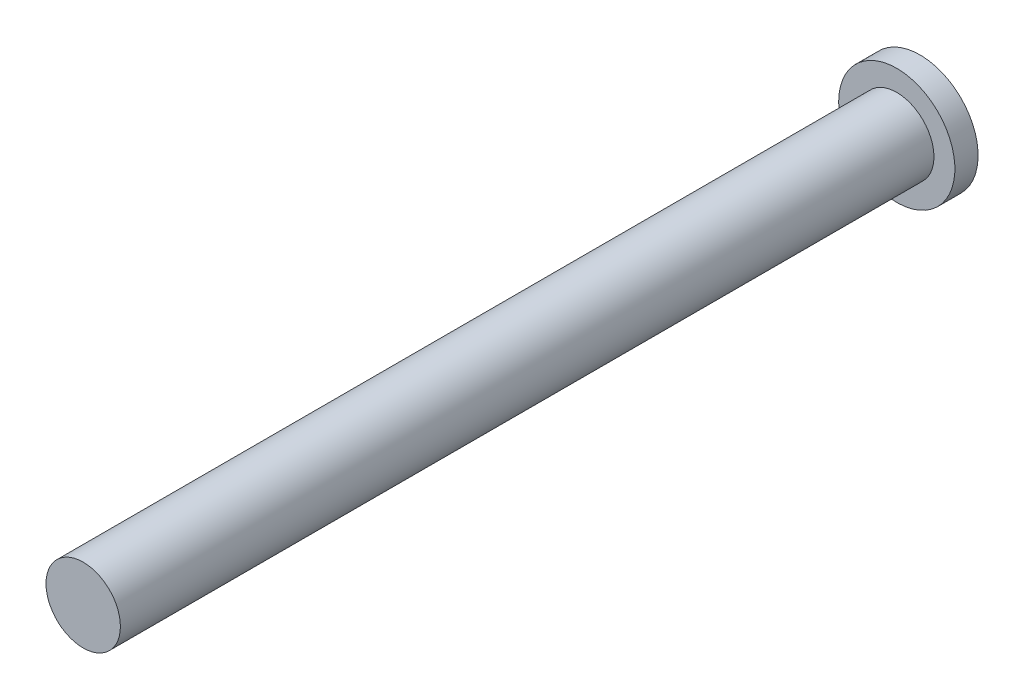
ISO-10303-21;
HEADER;
FILE_DESCRIPTION(('STEP AP214'),'2;1');
FILE_NAME('part.step','',(''),(''),'','','');
FILE_SCHEMA(('AUTOMOTIVE_DESIGN { 1 0 10303 214 1 1 1 1 }'));
ENDSEC;
DATA;
#1=APPLICATION_CONTEXT('core data for automotive mechanical design processes');
#2=APPLICATION_PROTOCOL_DEFINITION('international standard','automotive_design',2000,#1);
#3=PRODUCT_CONTEXT('',#1,'mechanical');
#4=PRODUCT('Part','Part','',(#3));
#5=PRODUCT_RELATED_PRODUCT_CATEGORY('part','',(#4));
#6=PRODUCT_DEFINITION_FORMATION('','',#4);
#7=PRODUCT_DEFINITION_CONTEXT('part definition',#1,'design');
#8=PRODUCT_DEFINITION('design','',#6,#7);
#9=PRODUCT_DEFINITION_SHAPE('','',#8);
#10=(LENGTH_UNIT() NAMED_UNIT(*) SI_UNIT(.MILLI.,.METRE.));
#11=(NAMED_UNIT(*) PLANE_ANGLE_UNIT() SI_UNIT($,.RADIAN.));
#12=(NAMED_UNIT(*) SI_UNIT($,.STERADIAN.) SOLID_ANGLE_UNIT());
#13=UNCERTAINTY_MEASURE_WITH_UNIT(LENGTH_MEASURE(1.E-05),#10,'distance_accuracy_value','');
#14=(GEOMETRIC_REPRESENTATION_CONTEXT(3) GLOBAL_UNCERTAINTY_ASSIGNED_CONTEXT((#13)) GLOBAL_UNIT_ASSIGNED_CONTEXT((#10,
#11,#12)) REPRESENTATION_CONTEXT('',''));
#15=CARTESIAN_POINT('',(0.,0.,0.));
#16=DIRECTION('',(0.,0.,1.));
#17=DIRECTION('',(1.,0.,0.));
#18=AXIS2_PLACEMENT_3D('',#15,#16,#17);
#19=CARTESIAN_POINT('',(0.,0.,35.));
#20=DIRECTION('',(0.,0.,-1.));
#21=DIRECTION('',(-1.,0.,0.));
#22=AXIS2_PLACEMENT_3D('',#19,#20,#21);
#23=CYLINDRICAL_SURFACE('',#22,1.6);
#24=CARTESIAN_POINT('',(0.,0.,35.));
#25=DIRECTION('',(0.,0.,1.));
#26=DIRECTION('',(1.,0.,0.));
#27=AXIS2_PLACEMENT_3D('',#24,#25,#26);
#28=CIRCLE('',#27,1.6);
#29=CARTESIAN_POINT('',(1.6,0.,35.));
#30=VERTEX_POINT('',#29);
#31=EDGE_CURVE('E10',#30,#30,#28,.T.);
#32=ORIENTED_EDGE('',*,*,#31,.F.);
#33=EDGE_LOOP('',(#32));
#34=FACE_BOUND('',#33,.T.);
#35=CARTESIAN_POINT('',(0.,0.,0.));
#36=DIRECTION('',(0.,0.,-1.));
#37=DIRECTION('',(-1.,0.,0.));
#38=AXIS2_PLACEMENT_3D('',#35,#36,#37);
#39=CIRCLE('',#38,1.6);
#40=CARTESIAN_POINT('',(-1.6,0.,0.));
#41=VERTEX_POINT('',#40);
#42=EDGE_CURVE('E39',#41,#41,#39,.T.);
#43=ORIENTED_EDGE('',*,*,#42,.F.);
#44=EDGE_LOOP('',(#43));
#45=FACE_BOUND('',#44,.T.);
#46=ADVANCED_FACE('F33',(#34,#45),#23,.T.);
#47=CARTESIAN_POINT('',(0.,0.,35.));
#48=DIRECTION('',(0.,0.,1.));
#49=DIRECTION('',(1.,0.,0.));
#50=AXIS2_PLACEMENT_3D('',#47,#48,#49);
#51=PLANE('',#50);
#52=ORIENTED_EDGE('',*,*,#31,.T.);
#53=EDGE_LOOP('',(#52));
#54=FACE_BOUND('',#53,.T.);
#55=ADVANCED_FACE('F66',(#54),#51,.T.);
#56=CARTESIAN_POINT('',(0.,0.,-1.));
#57=DIRECTION('',(0.,0.,1.));
#58=DIRECTION('',(1.,0.,0.));
#59=AXIS2_PLACEMENT_3D('',#56,#57,#58);
#60=CYLINDRICAL_SURFACE('',#59,2.5);
#61=CARTESIAN_POINT('',(0.,0.,-1.));
#62=DIRECTION('',(0.,0.,-1.));
#63=DIRECTION('',(-1.,0.,0.));
#64=AXIS2_PLACEMENT_3D('',#61,#62,#63);
#65=CIRCLE('',#64,2.5);
#66=CARTESIAN_POINT('',(-2.5,0.,-1.));
#67=VERTEX_POINT('',#66);
#68=EDGE_CURVE('E43',#67,#67,#65,.T.);
#69=ORIENTED_EDGE('',*,*,#68,.F.);
#70=EDGE_LOOP('',(#69));
#71=FACE_BOUND('',#70,.T.);
#72=CARTESIAN_POINT('',(0.,0.,0.));
#73=DIRECTION('',(0.,0.,-1.));
#74=DIRECTION('',(-1.,0.,0.));
#75=AXIS2_PLACEMENT_3D('',#72,#73,#74);
#76=CIRCLE('',#75,2.5);
#77=CARTESIAN_POINT('',(-2.5,0.,0.));
#78=VERTEX_POINT('',#77);
#79=EDGE_CURVE('E47',#78,#78,#76,.T.);
#80=ORIENTED_EDGE('',*,*,#79,.T.);
#81=EDGE_LOOP('',(#80));
#82=FACE_BOUND('',#81,.T.);
#83=ADVANCED_FACE('F53',(#71,#82),#60,.T.);
#84=CARTESIAN_POINT('',(0.,0.,-1.));
#85=DIRECTION('',(0.,0.,-1.));
#86=DIRECTION('',(-1.,0.,0.));
#87=AXIS2_PLACEMENT_3D('',#84,#85,#86);
#88=PLANE('',#87);
#89=ORIENTED_EDGE('',*,*,#68,.T.);
#90=EDGE_LOOP('',(#89));
#91=FACE_BOUND('',#90,.T.);
#92=ADVANCED_FACE('F57',(#91),#88,.T.);
#93=CARTESIAN_POINT('',(0.,0.,0.));
#94=DIRECTION('',(0.,0.,-1.));
#95=DIRECTION('',(-1.,0.,0.));
#96=AXIS2_PLACEMENT_3D('',#93,#94,#95);
#97=PLANE('',#96);
#98=ORIENTED_EDGE('',*,*,#42,.T.);
#99=EDGE_LOOP('',(#98));
#100=FACE_BOUND('',#99,.T.);
#101=ORIENTED_EDGE('',*,*,#79,.F.);
#102=EDGE_LOOP('',(#101));
#103=FACE_BOUND('',#102,.T.);
#104=ADVANCED_FACE('F55',(#100,#103),#97,.F.);
#105=CLOSED_SHELL('',(#46,#55,#83,#92,#104));
#106=MANIFOLD_SOLID_BREP('B2',#105);
#107=ADVANCED_BREP_SHAPE_REPRESENTATION('',(#18,#106),#14);
#108=SHAPE_DEFINITION_REPRESENTATION(#9,#107);
ENDSEC;
END-ISO-10303-21;
